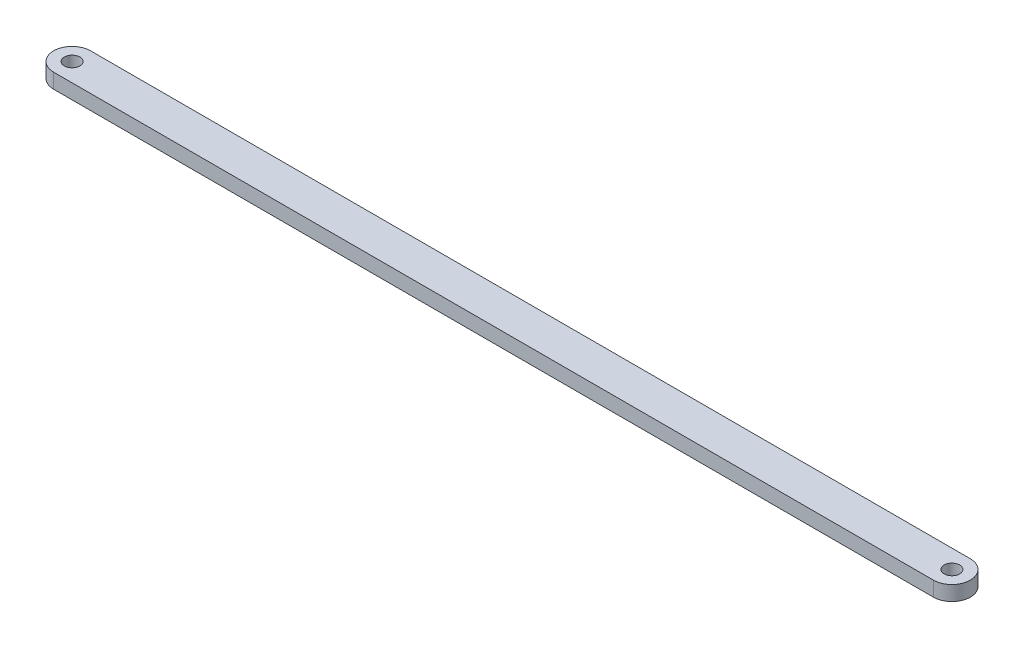
ISO-10303-21;
HEADER;
FILE_DESCRIPTION(('STEP AP214'),'2;1');
FILE_NAME('part.step','',(''),(''),'','','');
FILE_SCHEMA(('AUTOMOTIVE_DESIGN { 1 0 10303 214 1 1 1 1 }'));
ENDSEC;
DATA;
#1=APPLICATION_CONTEXT('core data for automotive mechanical design processes');
#2=APPLICATION_PROTOCOL_DEFINITION('international standard','automotive_design',2000,#1);
#3=PRODUCT_CONTEXT('',#1,'mechanical');
#4=PRODUCT('Part','Part','',(#3));
#5=PRODUCT_RELATED_PRODUCT_CATEGORY('part','',(#4));
#6=PRODUCT_DEFINITION_FORMATION('','',#4);
#7=PRODUCT_DEFINITION_CONTEXT('part definition',#1,'design');
#8=PRODUCT_DEFINITION('design','',#6,#7);
#9=PRODUCT_DEFINITION_SHAPE('','',#8);
#10=(LENGTH_UNIT() NAMED_UNIT(*) SI_UNIT(.MILLI.,.METRE.));
#11=(NAMED_UNIT(*) PLANE_ANGLE_UNIT() SI_UNIT($,.RADIAN.));
#12=(NAMED_UNIT(*) SI_UNIT($,.STERADIAN.) SOLID_ANGLE_UNIT());
#13=UNCERTAINTY_MEASURE_WITH_UNIT(LENGTH_MEASURE(1.E-05),#10,'distance_accuracy_value','');
#14=(GEOMETRIC_REPRESENTATION_CONTEXT(3) GLOBAL_UNCERTAINTY_ASSIGNED_CONTEXT((#13)) GLOBAL_UNIT_ASSIGNED_CONTEXT((#10,
#11,#12)) REPRESENTATION_CONTEXT('',''));
#15=CARTESIAN_POINT('',(0.,0.,0.));
#16=DIRECTION('',(0.,0.,1.));
#17=DIRECTION('',(1.,0.,0.));
#18=AXIS2_PLACEMENT_3D('',#15,#16,#17);
#19=CARTESIAN_POINT('',(0.,2.,0.));
#20=DIRECTION('',(0.,1.,0.));
#21=DIRECTION('',(0.,0.,1.));
#22=AXIS2_PLACEMENT_3D('',#19,#20,#21);
#23=PLANE('',#22);
#24=CARTESIAN_POINT('',(0.,2.,0.));
#25=DIRECTION('',(0.,1.,0.));
#26=DIRECTION('',(0.,0.,1.));
#27=AXIS2_PLACEMENT_3D('',#24,#25,#26);
#28=CIRCLE('',#27,1.05);
#29=CARTESIAN_POINT('',(0.,2.,1.05));
#30=VERTEX_POINT('',#29);
#31=EDGE_CURVE('E104',#30,#30,#28,.T.);
#32=ORIENTED_EDGE('',*,*,#31,.F.);
#33=EDGE_LOOP('',(#32));
#34=FACE_BOUND('',#33,.T.);
#35=CARTESIAN_POINT('',(0.,2.,0.));
#36=DIRECTION('',(0.,1.,0.));
#37=DIRECTION('',(0.,0.,1.));
#38=AXIS2_PLACEMENT_3D('',#35,#36,#37);
#39=CIRCLE('',#38,2.5);
#40=CARTESIAN_POINT('',(0.,2.,-2.5));
#41=VERTEX_POINT('',#40);
#42=CARTESIAN_POINT('',(0.,2.,2.5));
#43=VERTEX_POINT('',#42);
#44=EDGE_CURVE('E89',#41,#43,#39,.T.);
#45=ORIENTED_EDGE('',*,*,#44,.T.);
#46=DIRECTION('',(1.,0.,0.));
#47=VECTOR('',#46,1.);
#48=CARTESIAN_POINT('',(0.,2.,2.5));
#49=LINE('',#48,#47);
#50=CARTESIAN_POINT('',(119.,2.,2.5));
#51=VERTEX_POINT('',#50);
#52=EDGE_CURVE('E84',#43,#51,#49,.T.);
#53=ORIENTED_EDGE('',*,*,#52,.T.);
#54=CARTESIAN_POINT('',(119.,2.,0.));
#55=DIRECTION('',(0.,1.,0.));
#56=DIRECTION('',(0.,0.,1.));
#57=AXIS2_PLACEMENT_3D('',#54,#55,#56);
#58=CIRCLE('',#57,2.5);
#59=CARTESIAN_POINT('',(119.,2.,-2.5));
#60=VERTEX_POINT('',#59);
#61=EDGE_CURVE('E87',#51,#60,#58,.T.);
#62=ORIENTED_EDGE('',*,*,#61,.T.);
#63=DIRECTION('',(-1.,0.,0.));
#64=VECTOR('',#63,1.);
#65=CARTESIAN_POINT('',(0.,2.,-2.5));
#66=LINE('',#65,#64);
#67=EDGE_CURVE('E54',#60,#41,#66,.T.);
#68=ORIENTED_EDGE('',*,*,#67,.T.);
#69=EDGE_LOOP('',(#45,#53,#62,#68));
#70=FACE_BOUND('',#69,.T.);
#71=CARTESIAN_POINT('',(119.,2.,0.));
#72=DIRECTION('',(0.,1.,0.));
#73=DIRECTION('',(0.,0.,1.));
#74=AXIS2_PLACEMENT_3D('',#71,#72,#73);
#75=CIRCLE('',#74,1.04999999999999);
#76=CARTESIAN_POINT('',(119.,2.,1.04999999999999));
#77=VERTEX_POINT('',#76);
#78=EDGE_CURVE('E119',#77,#77,#75,.T.);
#79=ORIENTED_EDGE('',*,*,#78,.F.);
#80=EDGE_LOOP('',(#79));
#81=FACE_BOUND('',#80,.T.);
#82=ADVANCED_FACE('F37',(#34,#70,#81),#23,.T.);
#83=CARTESIAN_POINT('',(0.,0.,0.));
#84=DIRECTION('',(0.,1.,0.));
#85=DIRECTION('',(0.,0.,1.));
#86=AXIS2_PLACEMENT_3D('',#83,#84,#85);
#87=PLANE('',#86);
#88=CARTESIAN_POINT('',(0.,0.,0.));
#89=DIRECTION('',(0.,1.,0.));
#90=DIRECTION('',(0.,0.,1.));
#91=AXIS2_PLACEMENT_3D('',#88,#89,#90);
#92=CIRCLE('',#91,2.5);
#93=CARTESIAN_POINT('',(0.,0.,-2.5));
#94=VERTEX_POINT('',#93);
#95=CARTESIAN_POINT('',(0.,0.,2.5));
#96=VERTEX_POINT('',#95);
#97=EDGE_CURVE('E101',#94,#96,#92,.T.);
#98=ORIENTED_EDGE('',*,*,#97,.F.);
#99=DIRECTION('',(-1.,0.,0.));
#100=VECTOR('',#99,1.);
#101=CARTESIAN_POINT('',(0.,0.,-2.5));
#102=LINE('',#101,#100);
#103=CARTESIAN_POINT('',(119.,0.,-2.5));
#104=VERTEX_POINT('',#103);
#105=EDGE_CURVE('E77',#104,#94,#102,.T.);
#106=ORIENTED_EDGE('',*,*,#105,.F.);
#107=CARTESIAN_POINT('',(119.,0.,0.));
#108=DIRECTION('',(0.,1.,0.));
#109=DIRECTION('',(0.,0.,1.));
#110=AXIS2_PLACEMENT_3D('',#107,#108,#109);
#111=CIRCLE('',#110,2.5);
#112=CARTESIAN_POINT('',(119.,0.,2.5));
#113=VERTEX_POINT('',#112);
#114=EDGE_CURVE('E71',#113,#104,#111,.T.);
#115=ORIENTED_EDGE('',*,*,#114,.F.);
#116=DIRECTION('',(1.,0.,0.));
#117=VECTOR('',#116,1.);
#118=CARTESIAN_POINT('',(0.,0.,2.5));
#119=LINE('',#118,#117);
#120=EDGE_CURVE('E93',#96,#113,#119,.T.);
#121=ORIENTED_EDGE('',*,*,#120,.F.);
#122=EDGE_LOOP('',(#98,#106,#115,#121));
#123=FACE_BOUND('',#122,.T.);
#124=CARTESIAN_POINT('',(0.,0.,0.));
#125=DIRECTION('',(0.,1.,0.));
#126=DIRECTION('',(0.,0.,1.));
#127=AXIS2_PLACEMENT_3D('',#124,#125,#126);
#128=CIRCLE('',#127,1.05);
#129=CARTESIAN_POINT('',(0.,0.,1.05));
#130=VERTEX_POINT('',#129);
#131=EDGE_CURVE('E116',#130,#130,#128,.T.);
#132=ORIENTED_EDGE('',*,*,#131,.T.);
#133=EDGE_LOOP('',(#132));
#134=FACE_BOUND('',#133,.T.);
#135=CARTESIAN_POINT('',(119.,0.,0.));
#136=DIRECTION('',(0.,1.,0.));
#137=DIRECTION('',(0.,0.,1.));
#138=AXIS2_PLACEMENT_3D('',#135,#136,#137);
#139=CIRCLE('',#138,1.04999999999999);
#140=CARTESIAN_POINT('',(119.,0.,1.04999999999999));
#141=VERTEX_POINT('',#140);
#142=EDGE_CURVE('E122',#141,#141,#139,.T.);
#143=ORIENTED_EDGE('',*,*,#142,.T.);
#144=EDGE_LOOP('',(#143));
#145=FACE_BOUND('',#144,.T.);
#146=ADVANCED_FACE('F112',(#123,#134,#145),#87,.F.);
#147=CARTESIAN_POINT('',(0.,2.,0.));
#148=DIRECTION('',(0.,-1.,0.));
#149=DIRECTION('',(0.,0.,-1.));
#150=AXIS2_PLACEMENT_3D('',#147,#148,#149);
#151=CYLINDRICAL_SURFACE('',#150,2.5);
#152=ORIENTED_EDGE('',*,*,#97,.T.);
#153=DIRECTION('',(0.,-1.,0.));
#154=VECTOR('',#153,1.);
#155=CARTESIAN_POINT('',(0.,2.,2.5));
#156=LINE('',#155,#154);
#157=EDGE_CURVE('E11',#43,#96,#156,.T.);
#158=ORIENTED_EDGE('',*,*,#157,.F.);
#159=ORIENTED_EDGE('',*,*,#44,.F.);
#160=DIRECTION('',(0.,-1.,0.));
#161=VECTOR('',#160,1.);
#162=CARTESIAN_POINT('',(0.,2.,-2.5));
#163=LINE('',#162,#161);
#164=EDGE_CURVE('E97',#41,#94,#163,.T.);
#165=ORIENTED_EDGE('',*,*,#164,.T.);
#166=EDGE_LOOP('',(#152,#158,#159,#165));
#167=FACE_BOUND('',#166,.T.);
#168=ADVANCED_FACE('F39',(#167),#151,.T.);
#169=CARTESIAN_POINT('',(0.,2.,2.5));
#170=DIRECTION('',(0.,0.,-1.));
#171=DIRECTION('',(-1.,0.,0.));
#172=AXIS2_PLACEMENT_3D('',#169,#170,#171);
#173=PLANE('',#172);
#174=ORIENTED_EDGE('',*,*,#120,.T.);
#175=DIRECTION('',(0.,-1.,0.));
#176=VECTOR('',#175,1.);
#177=CARTESIAN_POINT('',(119.,2.,2.5));
#178=LINE('',#177,#176);
#179=EDGE_CURVE('E46',#51,#113,#178,.T.);
#180=ORIENTED_EDGE('',*,*,#179,.F.);
#181=ORIENTED_EDGE('',*,*,#52,.F.);
#182=ORIENTED_EDGE('',*,*,#157,.T.);
#183=EDGE_LOOP('',(#174,#180,#181,#182));
#184=FACE_BOUND('',#183,.T.);
#185=ADVANCED_FACE('F92',(#184),#173,.F.);
#186=CARTESIAN_POINT('',(119.,2.,0.));
#187=DIRECTION('',(0.,-1.,0.));
#188=DIRECTION('',(0.,0.,-1.));
#189=AXIS2_PLACEMENT_3D('',#186,#187,#188);
#190=CYLINDRICAL_SURFACE('',#189,2.5);
#191=ORIENTED_EDGE('',*,*,#114,.T.);
#192=DIRECTION('',(0.,-1.,0.));
#193=VECTOR('',#192,1.);
#194=CARTESIAN_POINT('',(119.,2.,-2.5));
#195=LINE('',#194,#193);
#196=EDGE_CURVE('E94',#60,#104,#195,.T.);
#197=ORIENTED_EDGE('',*,*,#196,.F.);
#198=ORIENTED_EDGE('',*,*,#61,.F.);
#199=ORIENTED_EDGE('',*,*,#179,.T.);
#200=EDGE_LOOP('',(#191,#197,#198,#199));
#201=FACE_BOUND('',#200,.T.);
#202=ADVANCED_FACE('F95',(#201),#190,.T.);
#203=CARTESIAN_POINT('',(0.,2.,-2.5));
#204=DIRECTION('',(0.,0.,1.));
#205=DIRECTION('',(1.,0.,0.));
#206=AXIS2_PLACEMENT_3D('',#203,#204,#205);
#207=PLANE('',#206);
#208=ORIENTED_EDGE('',*,*,#105,.T.);
#209=ORIENTED_EDGE('',*,*,#164,.F.);
#210=ORIENTED_EDGE('',*,*,#67,.F.);
#211=ORIENTED_EDGE('',*,*,#196,.T.);
#212=EDGE_LOOP('',(#208,#209,#210,#211));
#213=FACE_BOUND('',#212,.T.);
#214=ADVANCED_FACE('F109',(#213),#207,.F.);
#215=CARTESIAN_POINT('',(0.,2.,0.));
#216=DIRECTION('',(0.,-1.,0.));
#217=DIRECTION('',(0.,0.,-1.));
#218=AXIS2_PLACEMENT_3D('',#215,#216,#217);
#219=CYLINDRICAL_SURFACE('',#218,1.05);
#220=ORIENTED_EDGE('',*,*,#31,.T.);
#221=EDGE_LOOP('',(#220));
#222=FACE_BOUND('',#221,.T.);
#223=ORIENTED_EDGE('',*,*,#131,.F.);
#224=EDGE_LOOP('',(#223));
#225=FACE_BOUND('',#224,.T.);
#226=ADVANCED_FACE('F139',(#222,#225),#219,.F.);
#227=CARTESIAN_POINT('',(119.,2.,0.));
#228=DIRECTION('',(0.,-1.,0.));
#229=DIRECTION('',(0.,0.,-1.));
#230=AXIS2_PLACEMENT_3D('',#227,#228,#229);
#231=CYLINDRICAL_SURFACE('',#230,1.04999999999999);
#232=ORIENTED_EDGE('',*,*,#78,.T.);
#233=EDGE_LOOP('',(#232));
#234=FACE_BOUND('',#233,.T.);
#235=ORIENTED_EDGE('',*,*,#142,.F.);
#236=EDGE_LOOP('',(#235));
#237=FACE_BOUND('',#236,.T.);
#238=ADVANCED_FACE('F128',(#234,#237),#231,.F.);
#239=CLOSED_SHELL('',(#82,#146,#168,#185,#202,#214,#226,#238));
#240=MANIFOLD_SOLID_BREP('B2',#239);
#241=ADVANCED_BREP_SHAPE_REPRESENTATION('',(#18,#240),#14);
#242=SHAPE_DEFINITION_REPRESENTATION(#9,#241);
ENDSEC;
END-ISO-10303-21;
